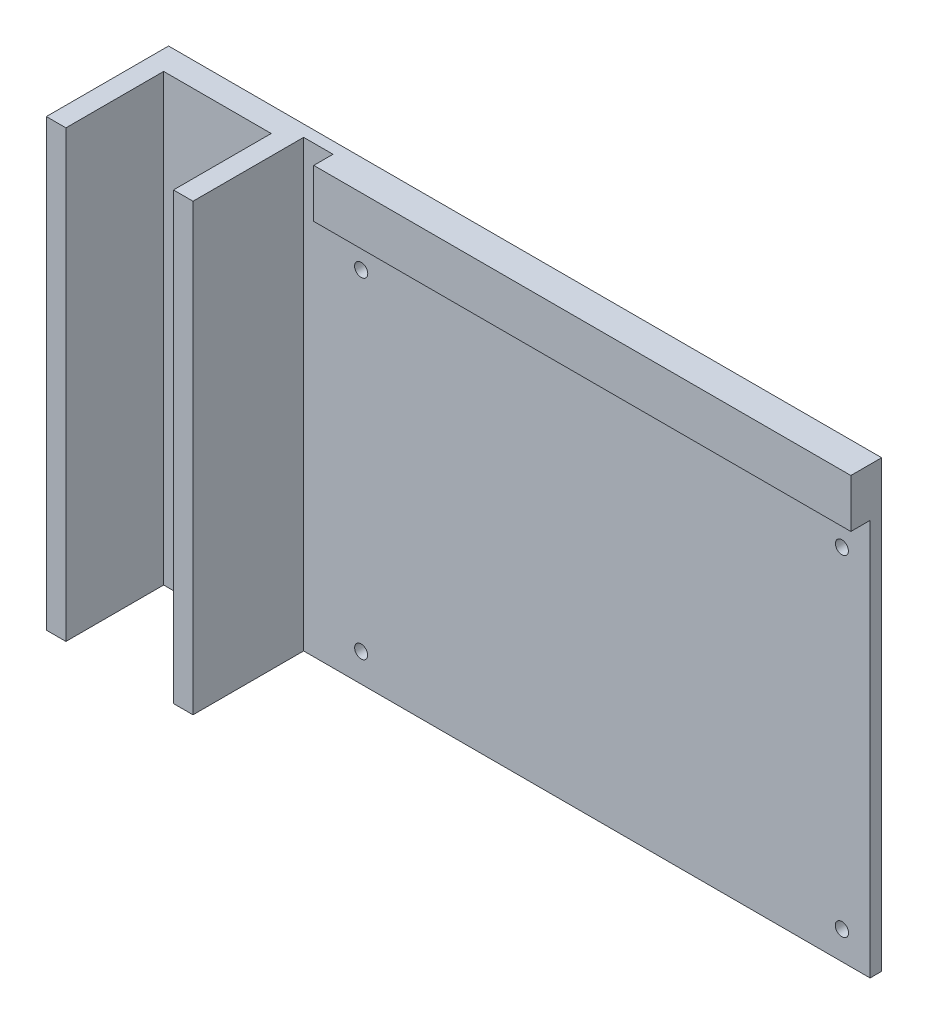
ISO-10303-21;
HEADER;
FILE_DESCRIPTION(('STEP AP214'),'2;1');
FILE_NAME('part.step','',(''),(''),'','','');
FILE_SCHEMA(('AUTOMOTIVE_DESIGN { 1 0 10303 214 1 1 1 1 }'));
ENDSEC;
DATA;
#1=APPLICATION_CONTEXT('core data for automotive mechanical design processes');
#2=APPLICATION_PROTOCOL_DEFINITION('international standard','automotive_design',2000,#1);
#3=PRODUCT_CONTEXT('',#1,'mechanical');
#4=PRODUCT('Part','Part','',(#3));
#5=PRODUCT_RELATED_PRODUCT_CATEGORY('part','',(#4));
#6=PRODUCT_DEFINITION_FORMATION('','',#4);
#7=PRODUCT_DEFINITION_CONTEXT('part definition',#1,'design');
#8=PRODUCT_DEFINITION('design','',#6,#7);
#9=PRODUCT_DEFINITION_SHAPE('','',#8);
#10=(LENGTH_UNIT() NAMED_UNIT(*) SI_UNIT(.MILLI.,.METRE.));
#11=(NAMED_UNIT(*) PLANE_ANGLE_UNIT() SI_UNIT($,.RADIAN.));
#12=(NAMED_UNIT(*) SI_UNIT($,.STERADIAN.) SOLID_ANGLE_UNIT());
#13=UNCERTAINTY_MEASURE_WITH_UNIT(LENGTH_MEASURE(1.E-05),#10,'distance_accuracy_value','');
#14=(GEOMETRIC_REPRESENTATION_CONTEXT(3) GLOBAL_UNCERTAINTY_ASSIGNED_CONTEXT((#13)) GLOBAL_UNIT_ASSIGNED_CONTEXT((#10,
#11,#12)) REPRESENTATION_CONTEXT('',''));
#15=CARTESIAN_POINT('',(0.,0.,0.));
#16=DIRECTION('',(0.,0.,1.));
#17=DIRECTION('',(1.,0.,0.));
#18=AXIS2_PLACEMENT_3D('',#15,#16,#17);
#19=CARTESIAN_POINT('',(0.,0.,31.75));
#20=DIRECTION('',(0.,0.,1.));
#21=DIRECTION('',(1.,0.,0.));
#22=AXIS2_PLACEMENT_3D('',#19,#20,#21);
#23=PLANE('',#22);
#24=DIRECTION('',(0.,1.,0.));
#25=VECTOR('',#24,1.);
#26=CARTESIAN_POINT('',(-82.4741811936296,56.515,31.75));
#27=LINE('',#26,#25);
#28=CARTESIAN_POINT('',(-82.4741811936296,-53.975,31.75));
#29=VERTEX_POINT('',#28);
#30=CARTESIAN_POINT('',(-82.4741811936296,61.595,31.75));
#31=VERTEX_POINT('',#30);
#32=EDGE_CURVE('E140',#29,#31,#27,.T.);
#33=ORIENTED_EDGE('',*,*,#32,.F.);
#34=DIRECTION('',(-1.,0.,0.));
#35=VECTOR('',#34,1.);
#36=CARTESIAN_POINT('',(-77.3941811936296,-53.975,31.75));
#37=LINE('',#36,#35);
#38=CARTESIAN_POINT('',(-77.3941811936296,-53.975,31.75));
#39=VERTEX_POINT('',#38);
#40=EDGE_CURVE('E173',#39,#29,#37,.T.);
#41=ORIENTED_EDGE('',*,*,#40,.F.);
#42=DIRECTION('',(0.,-1.,0.));
#43=VECTOR('',#42,1.);
#44=CARTESIAN_POINT('',(-77.3941811936296,61.595,31.75));
#45=LINE('',#44,#43);
#46=CARTESIAN_POINT('',(-77.3941811936296,61.595,31.75));
#47=VERTEX_POINT('',#46);
#48=EDGE_CURVE('E168',#47,#39,#45,.T.);
#49=ORIENTED_EDGE('',*,*,#48,.F.);
#50=DIRECTION('',(1.,0.,0.));
#51=VECTOR('',#50,1.);
#52=CARTESIAN_POINT('',(-77.3941811936296,61.595,31.75));
#53=LINE('',#52,#51);
#54=EDGE_CURVE('E169',#31,#47,#53,.T.);
#55=ORIENTED_EDGE('',*,*,#54,.F.);
#56=EDGE_LOOP('',(#33,#41,#49,#55));
#57=FACE_BOUND('',#56,.T.);
#58=ADVANCED_FACE('F37',(#57),#23,.T.);
#59=CARTESIAN_POINT('',(-69.7741811936296,52.705,3.));
#60=DIRECTION('',(1.,0.,0.));
#61=DIRECTION('',(0.,0.,-1.));
#62=AXIS2_PLACEMENT_3D('',#59,#60,#61);
#63=PLANE('',#62);
#64=DIRECTION('',(0.,1.,0.));
#65=VECTOR('',#64,1.);
#66=CARTESIAN_POINT('',(-69.7741811936296,0.,3.));
#67=LINE('',#66,#65);
#68=CARTESIAN_POINT('',(-69.7741811936296,48.9936012751855,3.));
#69=VERTEX_POINT('',#68);
#70=CARTESIAN_POINT('',(-69.7741811936296,61.595,3.));
#71=VERTEX_POINT('',#70);
#72=EDGE_CURVE('E11',#69,#71,#67,.T.);
#73=ORIENTED_EDGE('',*,*,#72,.F.);
#74=DIRECTION('',(0.,0.,-1.));
#75=VECTOR('',#74,1.);
#76=CARTESIAN_POINT('',(-69.7741811936296,48.9936012751855,8.));
#77=LINE('',#76,#75);
#78=CARTESIAN_POINT('',(-69.7741811936296,48.9936012751855,8.));
#79=VERTEX_POINT('',#78);
#80=EDGE_CURVE('E220',#79,#69,#77,.T.);
#81=ORIENTED_EDGE('',*,*,#80,.F.);
#82=DIRECTION('',(0.,-1.,0.));
#83=VECTOR('',#82,1.);
#84=CARTESIAN_POINT('',(-69.7741811936296,52.705,8.));
#85=LINE('',#84,#83);
#86=CARTESIAN_POINT('',(-69.7741811936296,61.595,8.));
#87=VERTEX_POINT('',#86);
#88=EDGE_CURVE('E208',#87,#79,#85,.T.);
#89=ORIENTED_EDGE('',*,*,#88,.F.);
#90=DIRECTION('',(0.,0.,1.));
#91=VECTOR('',#90,1.);
#92=CARTESIAN_POINT('',(-69.7741811936296,61.595,8.));
#93=LINE('',#92,#91);
#94=EDGE_CURVE('E195',#71,#87,#93,.T.);
#95=ORIENTED_EDGE('',*,*,#94,.F.);
#96=EDGE_LOOP('',(#73,#81,#89,#95));
#97=FACE_BOUND('',#96,.T.);
#98=ADVANCED_FACE('F39',(#97),#63,.F.);
#99=CARTESIAN_POINT('',(0.,0.,3.));
#100=DIRECTION('',(0.,0.,1.));
#101=DIRECTION('',(1.,0.,0.));
#102=AXIS2_PLACEMENT_3D('',#99,#100,#101);
#103=PLANE('',#102);
#104=DIRECTION('',(1.,0.,0.));
#105=VECTOR('',#104,1.);
#106=CARTESIAN_POINT('',(-69.7741811936296,48.9936012751855,3.));
#107=LINE('',#106,#105);
#108=CARTESIAN_POINT('',(69.7741811936296,48.9936012751855,3.));
#109=VERTEX_POINT('',#108);
#110=EDGE_CURVE('E207',#69,#109,#107,.T.);
#111=ORIENTED_EDGE('',*,*,#110,.F.);
#112=ORIENTED_EDGE('',*,*,#72,.T.);
#113=DIRECTION('',(-1.,0.,0.));
#114=VECTOR('',#113,1.);
#115=CARTESIAN_POINT('',(0.,61.595,3.));
#116=LINE('',#115,#114);
#117=CARTESIAN_POINT('',(-77.3941811936296,61.595,3.));
#118=VERTEX_POINT('',#117);
#119=EDGE_CURVE('E184',#71,#118,#116,.T.);
#120=ORIENTED_EDGE('',*,*,#119,.T.);
#121=DIRECTION('',(0.,-1.,0.));
#122=VECTOR('',#121,1.);
#123=CARTESIAN_POINT('',(-77.3941811936296,0.,3.));
#124=LINE('',#123,#122);
#125=CARTESIAN_POINT('',(-77.3941811936296,-53.975,3.));
#126=VERTEX_POINT('',#125);
#127=EDGE_CURVE('E192',#118,#126,#124,.T.);
#128=ORIENTED_EDGE('',*,*,#127,.T.);
#129=DIRECTION('',(1.,0.,0.));
#130=VECTOR('',#129,1.);
#131=CARTESIAN_POINT('',(-69.7741811936296,-53.975,3.));
#132=LINE('',#131,#130);
#133=CARTESIAN_POINT('',(69.7741811936296,-53.975,3.));
#134=VERTEX_POINT('',#133);
#135=EDGE_CURVE('E248',#126,#134,#132,.T.);
#136=ORIENTED_EDGE('',*,*,#135,.T.);
#137=DIRECTION('',(0.,1.,0.));
#138=VECTOR('',#137,1.);
#139=CARTESIAN_POINT('',(69.7741811936296,52.705,3.));
#140=LINE('',#139,#138);
#141=EDGE_CURVE('E250',#134,#109,#140,.T.);
#142=ORIENTED_EDGE('',*,*,#141,.T.);
#143=EDGE_LOOP('',(#111,#112,#120,#128,#136,#142));
#144=FACE_BOUND('',#143,.T.);
#145=CARTESIAN_POINT('',(62.4492046310666,39.274150641449,3.));
#146=DIRECTION('',(0.,0.,1.));
#147=DIRECTION('',(1.,0.,0.));
#148=AXIS2_PLACEMENT_3D('',#145,#146,#147);
#149=CIRCLE('',#148,1.6915601609707);
#150=CARTESIAN_POINT('',(64.1407647920373,39.274150641449,3.));
#151=VERTEX_POINT('',#150);
#152=EDGE_CURVE('E230',#151,#151,#149,.T.);
#153=ORIENTED_EDGE('',*,*,#152,.F.);
#154=EDGE_LOOP('',(#153));
#155=FACE_BOUND('',#154,.T.);
#156=CARTESIAN_POINT('',(-62.4579049077393,-46.6153381725583,3.));
#157=DIRECTION('',(0.,0.,1.));
#158=DIRECTION('',(1.,0.,0.));
#159=AXIS2_PLACEMENT_3D('',#156,#157,#158);
#160=CIRCLE('',#159,1.69442291686616);
#161=CARTESIAN_POINT('',(-60.7634819908732,-46.6153381725583,3.));
#162=VERTEX_POINT('',#161);
#163=EDGE_CURVE('E242',#162,#162,#160,.T.);
#164=ORIENTED_EDGE('',*,*,#163,.F.);
#165=EDGE_LOOP('',(#164));
#166=FACE_BOUND('',#165,.T.);
#167=CARTESIAN_POINT('',(62.445492634338,-46.647315498427,3.));
#168=DIRECTION('',(0.,0.,1.));
#169=DIRECTION('',(1.,0.,0.));
#170=AXIS2_PLACEMENT_3D('',#167,#168,#169);
#171=CIRCLE('',#170,1.72646964960323);
#172=CARTESIAN_POINT('',(64.1719622839412,-46.647315498427,3.));
#173=VERTEX_POINT('',#172);
#174=EDGE_CURVE('E236',#173,#173,#171,.T.);
#175=ORIENTED_EDGE('',*,*,#174,.F.);
#176=EDGE_LOOP('',(#175));
#177=FACE_BOUND('',#176,.T.);
#178=CARTESIAN_POINT('',(-62.4506613473852,39.2535587793582,3.));
#179=DIRECTION('',(0.,0.,1.));
#180=DIRECTION('',(1.,0.,0.));
#181=AXIS2_PLACEMENT_3D('',#178,#179,#180);
#182=CIRCLE('',#181,1.71179892294587);
#183=CARTESIAN_POINT('',(-60.7388624244394,39.2535587793582,3.));
#184=VERTEX_POINT('',#183);
#185=EDGE_CURVE('E224',#184,#184,#182,.T.);
#186=ORIENTED_EDGE('',*,*,#185,.F.);
#187=EDGE_LOOP('',(#186));
#188=FACE_BOUND('',#187,.T.);
#189=ADVANCED_FACE('F279',(#144,#155,#166,#177,#188),#103,.T.);
#190=CARTESIAN_POINT('',(0.,0.,0.));
#191=DIRECTION('',(0.,0.,1.));
#192=DIRECTION('',(1.,0.,0.));
#193=AXIS2_PLACEMENT_3D('',#190,#191,#192);
#194=PLANE('',#193);
#195=DIRECTION('',(1.,0.,0.));
#196=VECTOR('',#195,1.);
#197=CARTESIAN_POINT('',(-69.7741811936296,-53.975,0.));
#198=LINE('',#197,#196);
#199=CARTESIAN_POINT('',(-115.49418119363,-53.975,0.));
#200=VERTEX_POINT('',#199);
#201=CARTESIAN_POINT('',(69.7741811936296,-53.975,0.));
#202=VERTEX_POINT('',#201);
#203=EDGE_CURVE('E245',#200,#202,#198,.T.);
#204=ORIENTED_EDGE('',*,*,#203,.F.);
#205=DIRECTION('',(0.,1.,0.));
#206=VECTOR('',#205,1.);
#207=CARTESIAN_POINT('',(-115.49418119363,61.595,0.));
#208=LINE('',#207,#206);
#209=CARTESIAN_POINT('',(-115.49418119363,61.595,0.));
#210=VERTEX_POINT('',#209);
#211=EDGE_CURVE('E160',#200,#210,#208,.T.);
#212=ORIENTED_EDGE('',*,*,#211,.T.);
#213=DIRECTION('',(-1.,0.,0.));
#214=VECTOR('',#213,1.);
#215=CARTESIAN_POINT('',(-69.7741811936296,61.595,0.));
#216=LINE('',#215,#214);
#217=CARTESIAN_POINT('',(69.7741811936296,61.595,0.));
#218=VERTEX_POINT('',#217);
#219=EDGE_CURVE('E205',#218,#210,#216,.T.);
#220=ORIENTED_EDGE('',*,*,#219,.F.);
#221=DIRECTION('',(0.,1.,0.));
#222=VECTOR('',#221,1.);
#223=CARTESIAN_POINT('',(69.7741811936296,52.705,0.));
#224=LINE('',#223,#222);
#225=EDGE_CURVE('E251',#202,#218,#224,.T.);
#226=ORIENTED_EDGE('',*,*,#225,.F.);
#227=EDGE_LOOP('',(#204,#212,#220,#226));
#228=FACE_BOUND('',#227,.T.);
#229=CARTESIAN_POINT('',(-62.4579049077393,-46.6153381725583,0.));
#230=DIRECTION('',(0.,0.,1.));
#231=DIRECTION('',(1.,0.,0.));
#232=AXIS2_PLACEMENT_3D('',#229,#230,#231);
#233=CIRCLE('',#232,1.69442291686616);
#234=CARTESIAN_POINT('',(-60.7634819908732,-46.6153381725583,0.));
#235=VERTEX_POINT('',#234);
#236=EDGE_CURVE('E239',#235,#235,#233,.T.);
#237=ORIENTED_EDGE('',*,*,#236,.T.);
#238=EDGE_LOOP('',(#237));
#239=FACE_BOUND('',#238,.T.);
#240=CARTESIAN_POINT('',(62.445492634338,-46.647315498427,0.));
#241=DIRECTION('',(0.,0.,1.));
#242=DIRECTION('',(1.,0.,0.));
#243=AXIS2_PLACEMENT_3D('',#240,#241,#242);
#244=CIRCLE('',#243,1.72646964960323);
#245=CARTESIAN_POINT('',(64.1719622839412,-46.647315498427,0.));
#246=VERTEX_POINT('',#245);
#247=EDGE_CURVE('E233',#246,#246,#244,.T.);
#248=ORIENTED_EDGE('',*,*,#247,.T.);
#249=EDGE_LOOP('',(#248));
#250=FACE_BOUND('',#249,.T.);
#251=CARTESIAN_POINT('',(62.4492046310666,39.274150641449,0.));
#252=DIRECTION('',(0.,0.,1.));
#253=DIRECTION('',(1.,0.,0.));
#254=AXIS2_PLACEMENT_3D('',#251,#252,#253);
#255=CIRCLE('',#254,1.6915601609707);
#256=CARTESIAN_POINT('',(64.1407647920373,39.274150641449,0.));
#257=VERTEX_POINT('',#256);
#258=EDGE_CURVE('E227',#257,#257,#255,.T.);
#259=ORIENTED_EDGE('',*,*,#258,.T.);
#260=EDGE_LOOP('',(#259));
#261=FACE_BOUND('',#260,.T.);
#262=CARTESIAN_POINT('',(-62.4506613473852,39.2535587793582,0.));
#263=DIRECTION('',(0.,0.,1.));
#264=DIRECTION('',(1.,0.,0.));
#265=AXIS2_PLACEMENT_3D('',#262,#263,#264);
#266=CIRCLE('',#265,1.71179892294587);
#267=CARTESIAN_POINT('',(-60.7388624244394,39.2535587793582,0.));
#268=VERTEX_POINT('',#267);
#269=EDGE_CURVE('E223',#268,#268,#266,.T.);
#270=ORIENTED_EDGE('',*,*,#269,.T.);
#271=EDGE_LOOP('',(#270));
#272=FACE_BOUND('',#271,.T.);
#273=ADVANCED_FACE('F266',(#228,#239,#250,#261,#272),#194,.F.);
#274=CARTESIAN_POINT('',(-69.7741811936296,-53.975,3.));
#275=DIRECTION('',(0.,1.,0.));
#276=DIRECTION('',(0.,0.,1.));
#277=AXIS2_PLACEMENT_3D('',#274,#275,#276);
#278=PLANE('',#277);
#279=ORIENTED_EDGE('',*,*,#40,.T.);
#280=DIRECTION('',(0.,0.,1.));
#281=VECTOR('',#280,1.);
#282=CARTESIAN_POINT('',(-82.4741811936296,-53.975,6.35));
#283=LINE('',#282,#281);
#284=CARTESIAN_POINT('',(-82.4741811936296,-53.975,6.35));
#285=VERTEX_POINT('',#284);
#286=EDGE_CURVE('E148',#285,#29,#283,.T.);
#287=ORIENTED_EDGE('',*,*,#286,.F.);
#288=DIRECTION('',(1.,0.,0.));
#289=VECTOR('',#288,1.);
#290=CARTESIAN_POINT('',(-110.41418119363,-53.975,6.35));
#291=LINE('',#290,#289);
#292=CARTESIAN_POINT('',(-110.41418119363,-53.975,6.35));
#293=VERTEX_POINT('',#292);
#294=EDGE_CURVE('E136',#293,#285,#291,.T.);
#295=ORIENTED_EDGE('',*,*,#294,.F.);
#296=DIRECTION('',(0.,0.,1.));
#297=VECTOR('',#296,1.);
#298=CARTESIAN_POINT('',(-110.41418119363,-53.975,6.35));
#299=LINE('',#298,#297);
#300=CARTESIAN_POINT('',(-110.41418119363,-53.975,31.75));
#301=VERTEX_POINT('',#300);
#302=EDGE_CURVE('E143',#293,#301,#299,.T.);
#303=ORIENTED_EDGE('',*,*,#302,.T.);
#304=CARTESIAN_POINT('',(-115.49418119363,-53.975,31.75));
#305=VERTEX_POINT('',#304);
#306=EDGE_CURVE('E172',#301,#305,#37,.T.);
#307=ORIENTED_EDGE('',*,*,#306,.T.);
#308=DIRECTION('',(0.,0.,-1.));
#309=VECTOR('',#308,1.);
#310=CARTESIAN_POINT('',(-115.49418119363,-53.975,31.75));
#311=LINE('',#310,#309);
#312=EDGE_CURVE('E185',#305,#200,#311,.T.);
#313=ORIENTED_EDGE('',*,*,#312,.T.);
#314=ORIENTED_EDGE('',*,*,#203,.T.);
#315=DIRECTION('',(0.,0.,-1.));
#316=VECTOR('',#315,1.);
#317=CARTESIAN_POINT('',(69.7741811936296,-53.975,3.));
#318=LINE('',#317,#316);
#319=EDGE_CURVE('E41',#134,#202,#318,.T.);
#320=ORIENTED_EDGE('',*,*,#319,.F.);
#321=ORIENTED_EDGE('',*,*,#135,.F.);
#322=DIRECTION('',(0.,0.,-1.));
#323=VECTOR('',#322,1.);
#324=CARTESIAN_POINT('',(-77.3941811936296,-53.975,31.75));
#325=LINE('',#324,#323);
#326=EDGE_CURVE('E188',#39,#126,#325,.T.);
#327=ORIENTED_EDGE('',*,*,#326,.F.);
#328=EDGE_LOOP('',(#279,#287,#295,#303,#307,#313,#314,#320,#321,#327));
#329=FACE_BOUND('',#328,.T.);
#330=ADVANCED_FACE('F151',(#329),#278,.F.);
#331=CARTESIAN_POINT('',(69.7741811936296,52.705,3.));
#332=DIRECTION('',(-1.,0.,0.));
#333=DIRECTION('',(0.,0.,1.));
#334=AXIS2_PLACEMENT_3D('',#331,#332,#333);
#335=PLANE('',#334);
#336=ORIENTED_EDGE('',*,*,#225,.T.);
#337=DIRECTION('',(0.,0.,-1.));
#338=VECTOR('',#337,1.);
#339=CARTESIAN_POINT('',(69.7741811936296,61.595,8.));
#340=LINE('',#339,#338);
#341=CARTESIAN_POINT('',(69.7741811936296,61.595,8.));
#342=VERTEX_POINT('',#341);
#343=EDGE_CURVE('E202',#342,#218,#340,.T.);
#344=ORIENTED_EDGE('',*,*,#343,.F.);
#345=DIRECTION('',(0.,1.,0.));
#346=VECTOR('',#345,1.);
#347=CARTESIAN_POINT('',(69.7741811936296,52.705,8.));
#348=LINE('',#347,#346);
#349=CARTESIAN_POINT('',(69.7741811936296,48.9936012751855,8.));
#350=VERTEX_POINT('',#349);
#351=EDGE_CURVE('E213',#350,#342,#348,.T.);
#352=ORIENTED_EDGE('',*,*,#351,.F.);
#353=DIRECTION('',(0.,0.,-1.));
#354=VECTOR('',#353,1.);
#355=CARTESIAN_POINT('',(69.7741811936296,48.9936012751855,8.));
#356=LINE('',#355,#354);
#357=EDGE_CURVE('E215',#350,#109,#356,.T.);
#358=ORIENTED_EDGE('',*,*,#357,.T.);
#359=ORIENTED_EDGE('',*,*,#141,.F.);
#360=ORIENTED_EDGE('',*,*,#319,.T.);
#361=EDGE_LOOP('',(#336,#344,#352,#358,#359,#360));
#362=FACE_BOUND('',#361,.T.);
#363=ADVANCED_FACE('F257',(#362),#335,.F.);
#364=CARTESIAN_POINT('',(-62.4579049077393,-46.6153381725583,3.));
#365=DIRECTION('',(0.,0.,-1.));
#366=DIRECTION('',(-1.,0.,0.));
#367=AXIS2_PLACEMENT_3D('',#364,#365,#366);
#368=CYLINDRICAL_SURFACE('',#367,1.69442291686616);
#369=ORIENTED_EDGE('',*,*,#163,.T.);
#370=EDGE_LOOP('',(#369));
#371=FACE_BOUND('',#370,.T.);
#372=ORIENTED_EDGE('',*,*,#236,.F.);
#373=EDGE_LOOP('',(#372));
#374=FACE_BOUND('',#373,.T.);
#375=ADVANCED_FACE('F379',(#371,#374),#368,.F.);
#376=CARTESIAN_POINT('',(62.445492634338,-46.647315498427,3.));
#377=DIRECTION('',(0.,0.,-1.));
#378=DIRECTION('',(-1.,0.,0.));
#379=AXIS2_PLACEMENT_3D('',#376,#377,#378);
#380=CYLINDRICAL_SURFACE('',#379,1.72646964960323);
#381=ORIENTED_EDGE('',*,*,#174,.T.);
#382=EDGE_LOOP('',(#381));
#383=FACE_BOUND('',#382,.T.);
#384=ORIENTED_EDGE('',*,*,#247,.F.);
#385=EDGE_LOOP('',(#384));
#386=FACE_BOUND('',#385,.T.);
#387=ADVANCED_FACE('F389',(#383,#386),#380,.F.);
#388=CARTESIAN_POINT('',(62.4492046310666,39.274150641449,3.));
#389=DIRECTION('',(0.,0.,-1.));
#390=DIRECTION('',(-1.,0.,0.));
#391=AXIS2_PLACEMENT_3D('',#388,#389,#390);
#392=CYLINDRICAL_SURFACE('',#391,1.6915601609707);
#393=ORIENTED_EDGE('',*,*,#152,.T.);
#394=EDGE_LOOP('',(#393));
#395=FACE_BOUND('',#394,.T.);
#396=ORIENTED_EDGE('',*,*,#258,.F.);
#397=EDGE_LOOP('',(#396));
#398=FACE_BOUND('',#397,.T.);
#399=ADVANCED_FACE('F399',(#395,#398),#392,.F.);
#400=CARTESIAN_POINT('',(-62.4506613473852,39.2535587793582,3.));
#401=DIRECTION('',(0.,0.,-1.));
#402=DIRECTION('',(-1.,0.,0.));
#403=AXIS2_PLACEMENT_3D('',#400,#401,#402);
#404=CYLINDRICAL_SURFACE('',#403,1.71179892294587);
#405=ORIENTED_EDGE('',*,*,#185,.T.);
#406=EDGE_LOOP('',(#405));
#407=FACE_BOUND('',#406,.T.);
#408=ORIENTED_EDGE('',*,*,#269,.F.);
#409=EDGE_LOOP('',(#408));
#410=FACE_BOUND('',#409,.T.);
#411=ADVANCED_FACE('F294',(#407,#410),#404,.F.);
#412=CARTESIAN_POINT('',(-69.7741811936296,48.9936012751855,8.));
#413=DIRECTION('',(0.,1.,0.));
#414=DIRECTION('',(0.,0.,1.));
#415=AXIS2_PLACEMENT_3D('',#412,#413,#414);
#416=PLANE('',#415);
#417=ORIENTED_EDGE('',*,*,#110,.T.);
#418=ORIENTED_EDGE('',*,*,#357,.F.);
#419=DIRECTION('',(1.,0.,0.));
#420=VECTOR('',#419,1.);
#421=CARTESIAN_POINT('',(-69.7741811936296,48.9936012751855,8.));
#422=LINE('',#421,#420);
#423=EDGE_CURVE('E211',#79,#350,#422,.T.);
#424=ORIENTED_EDGE('',*,*,#423,.F.);
#425=ORIENTED_EDGE('',*,*,#80,.T.);
#426=EDGE_LOOP('',(#417,#418,#424,#425));
#427=FACE_BOUND('',#426,.T.);
#428=ADVANCED_FACE('F282',(#427),#416,.F.);
#429=CARTESIAN_POINT('',(0.,0.,8.));
#430=DIRECTION('',(0.,0.,1.));
#431=DIRECTION('',(1.,0.,0.));
#432=AXIS2_PLACEMENT_3D('',#429,#430,#431);
#433=PLANE('',#432);
#434=ORIENTED_EDGE('',*,*,#88,.T.);
#435=ORIENTED_EDGE('',*,*,#423,.T.);
#436=ORIENTED_EDGE('',*,*,#351,.T.);
#437=DIRECTION('',(1.,0.,0.));
#438=VECTOR('',#437,1.);
#439=CARTESIAN_POINT('',(-69.7741811936296,61.595,8.));
#440=LINE('',#439,#438);
#441=EDGE_CURVE('E199',#87,#342,#440,.T.);
#442=ORIENTED_EDGE('',*,*,#441,.F.);
#443=EDGE_LOOP('',(#434,#435,#436,#442));
#444=FACE_BOUND('',#443,.T.);
#445=ADVANCED_FACE('F285',(#444),#433,.T.);
#446=CARTESIAN_POINT('',(0.,61.595,0.));
#447=DIRECTION('',(0.,-1.,0.));
#448=DIRECTION('',(0.,0.,-1.));
#449=AXIS2_PLACEMENT_3D('',#446,#447,#448);
#450=PLANE('',#449);
#451=DIRECTION('',(-1.,0.,0.));
#452=VECTOR('',#451,1.);
#453=CARTESIAN_POINT('',(-82.4741811936296,61.595,6.35));
#454=LINE('',#453,#452);
#455=CARTESIAN_POINT('',(-82.4741811936296,61.595,6.35));
#456=VERTEX_POINT('',#455);
#457=CARTESIAN_POINT('',(-110.41418119363,61.595,6.35));
#458=VERTEX_POINT('',#457);
#459=EDGE_CURVE('E139',#456,#458,#454,.T.);
#460=ORIENTED_EDGE('',*,*,#459,.F.);
#461=DIRECTION('',(0.,0.,1.));
#462=VECTOR('',#461,1.);
#463=CARTESIAN_POINT('',(-82.4741811936296,61.595,6.35));
#464=LINE('',#463,#462);
#465=EDGE_CURVE('E161',#456,#31,#464,.T.);
#466=ORIENTED_EDGE('',*,*,#465,.T.);
#467=ORIENTED_EDGE('',*,*,#54,.T.);
#468=DIRECTION('',(0.,0.,-1.));
#469=VECTOR('',#468,1.);
#470=CARTESIAN_POINT('',(-77.3941811936296,61.595,31.75));
#471=LINE('',#470,#469);
#472=EDGE_CURVE('E178',#47,#118,#471,.T.);
#473=ORIENTED_EDGE('',*,*,#472,.T.);
#474=ORIENTED_EDGE('',*,*,#119,.F.);
#475=ORIENTED_EDGE('',*,*,#94,.T.);
#476=ORIENTED_EDGE('',*,*,#441,.T.);
#477=ORIENTED_EDGE('',*,*,#343,.T.);
#478=ORIENTED_EDGE('',*,*,#219,.T.);
#479=DIRECTION('',(0.,0.,-1.));
#480=VECTOR('',#479,1.);
#481=CARTESIAN_POINT('',(-115.49418119363,61.595,31.75));
#482=LINE('',#481,#480);
#483=CARTESIAN_POINT('',(-115.49418119363,61.595,31.75));
#484=VERTEX_POINT('',#483);
#485=EDGE_CURVE('E181',#484,#210,#482,.T.);
#486=ORIENTED_EDGE('',*,*,#485,.F.);
#487=CARTESIAN_POINT('',(-110.41418119363,61.595,31.75));
#488=VERTEX_POINT('',#487);
#489=EDGE_CURVE('E165',#484,#488,#53,.T.);
#490=ORIENTED_EDGE('',*,*,#489,.T.);
#491=DIRECTION('',(0.,0.,1.));
#492=VECTOR('',#491,1.);
#493=CARTESIAN_POINT('',(-110.41418119363,61.595,6.35));
#494=LINE('',#493,#492);
#495=EDGE_CURVE('E53',#458,#488,#494,.T.);
#496=ORIENTED_EDGE('',*,*,#495,.F.);
#497=EDGE_LOOP('',(#460,#466,#467,#473,#474,#475,#476,#477,#478,#486,#490,#496));
#498=FACE_BOUND('',#497,.T.);
#499=ADVANCED_FACE('F264',(#498),#450,.F.);
#500=CARTESIAN_POINT('',(-77.3941811936296,61.595,31.75));
#501=DIRECTION('',(1.,0.,0.));
#502=DIRECTION('',(0.,1.,0.));
#503=AXIS2_PLACEMENT_3D('',#500,#501,#502);
#504=PLANE('',#503);
#505=ORIENTED_EDGE('',*,*,#127,.F.);
#506=ORIENTED_EDGE('',*,*,#472,.F.);
#507=ORIENTED_EDGE('',*,*,#48,.T.);
#508=ORIENTED_EDGE('',*,*,#326,.T.);
#509=EDGE_LOOP('',(#505,#506,#507,#508));
#510=FACE_BOUND('',#509,.T.);
#511=ADVANCED_FACE('F292',(#510),#504,.T.);
#512=CARTESIAN_POINT('',(-115.49418119363,61.595,31.75));
#513=DIRECTION('',(-1.,0.,0.));
#514=DIRECTION('',(0.,-1.,0.));
#515=AXIS2_PLACEMENT_3D('',#512,#513,#514);
#516=PLANE('',#515);
#517=ORIENTED_EDGE('',*,*,#211,.F.);
#518=ORIENTED_EDGE('',*,*,#312,.F.);
#519=DIRECTION('',(0.,1.,0.));
#520=VECTOR('',#519,1.);
#521=CARTESIAN_POINT('',(-115.49418119363,61.595,31.75));
#522=LINE('',#521,#520);
#523=EDGE_CURVE('E175',#305,#484,#522,.T.);
#524=ORIENTED_EDGE('',*,*,#523,.T.);
#525=ORIENTED_EDGE('',*,*,#485,.T.);
#526=EDGE_LOOP('',(#517,#518,#524,#525));
#527=FACE_BOUND('',#526,.T.);
#528=ADVANCED_FACE('F271',(#527),#516,.T.);
#529=DIRECTION('',(0.,-1.,0.));
#530=VECTOR('',#529,1.);
#531=CARTESIAN_POINT('',(-110.41418119363,-48.895,31.75));
#532=LINE('',#531,#530);
#533=EDGE_CURVE('E145',#488,#301,#532,.T.);
#534=ORIENTED_EDGE('',*,*,#533,.F.);
#535=ORIENTED_EDGE('',*,*,#489,.F.);
#536=ORIENTED_EDGE('',*,*,#523,.F.);
#537=ORIENTED_EDGE('',*,*,#306,.F.);
#538=EDGE_LOOP('',(#534,#535,#536,#537));
#539=FACE_BOUND('',#538,.T.);
#540=ADVANCED_FACE('F275',(#539),#23,.T.);
#541=CARTESIAN_POINT('',(-82.4741811936296,56.515,6.35));
#542=DIRECTION('',(1.,0.,0.));
#543=DIRECTION('',(0.,1.,0.));
#544=AXIS2_PLACEMENT_3D('',#541,#542,#543);
#545=PLANE('',#544);
#546=ORIENTED_EDGE('',*,*,#32,.T.);
#547=ORIENTED_EDGE('',*,*,#465,.F.);
#548=DIRECTION('',(0.,1.,0.));
#549=VECTOR('',#548,1.);
#550=CARTESIAN_POINT('',(-82.4741811936296,-53.975,6.35));
#551=LINE('',#550,#549);
#552=EDGE_CURVE('E152',#285,#456,#551,.T.);
#553=ORIENTED_EDGE('',*,*,#552,.F.);
#554=ORIENTED_EDGE('',*,*,#286,.T.);
#555=EDGE_LOOP('',(#546,#547,#553,#554));
#556=FACE_BOUND('',#555,.T.);
#557=ADVANCED_FACE('F306',(#556),#545,.F.);
#558=CARTESIAN_POINT('',(-110.41418119363,-48.895,6.35));
#559=DIRECTION('',(-1.,0.,0.));
#560=DIRECTION('',(0.,0.,1.));
#561=AXIS2_PLACEMENT_3D('',#558,#559,#560);
#562=PLANE('',#561);
#563=ORIENTED_EDGE('',*,*,#533,.T.);
#564=ORIENTED_EDGE('',*,*,#302,.F.);
#565=DIRECTION('',(0.,-1.,0.));
#566=VECTOR('',#565,1.);
#567=CARTESIAN_POINT('',(-110.41418119363,61.595,6.35));
#568=LINE('',#567,#566);
#569=EDGE_CURVE('E132',#458,#293,#568,.T.);
#570=ORIENTED_EDGE('',*,*,#569,.F.);
#571=ORIENTED_EDGE('',*,*,#495,.T.);
#572=EDGE_LOOP('',(#563,#564,#570,#571));
#573=FACE_BOUND('',#572,.T.);
#574=ADVANCED_FACE('F144',(#573),#562,.F.);
#575=CARTESIAN_POINT('',(0.,0.,6.35));
#576=DIRECTION('',(0.,0.,1.));
#577=DIRECTION('',(1.,0.,0.));
#578=AXIS2_PLACEMENT_3D('',#575,#576,#577);
#579=PLANE('',#578);
#580=ORIENTED_EDGE('',*,*,#569,.T.);
#581=ORIENTED_EDGE('',*,*,#294,.T.);
#582=ORIENTED_EDGE('',*,*,#552,.T.);
#583=ORIENTED_EDGE('',*,*,#459,.T.);
#584=EDGE_LOOP('',(#580,#581,#582,#583));
#585=FACE_BOUND('',#584,.T.);
#586=ADVANCED_FACE('F134',(#585),#579,.T.);
#587=CLOSED_SHELL('',(#58,#98,#189,#273,#330,#363,#375,#387,#399,#411,#428,#445,#499,#511,#528,
#540,#557,#574,#586));
#588=MANIFOLD_SOLID_BREP('B2',#587);
#589=ADVANCED_BREP_SHAPE_REPRESENTATION('',(#18,#588),#14);
#590=SHAPE_DEFINITION_REPRESENTATION(#9,#589);
ENDSEC;
END-ISO-10303-21;
